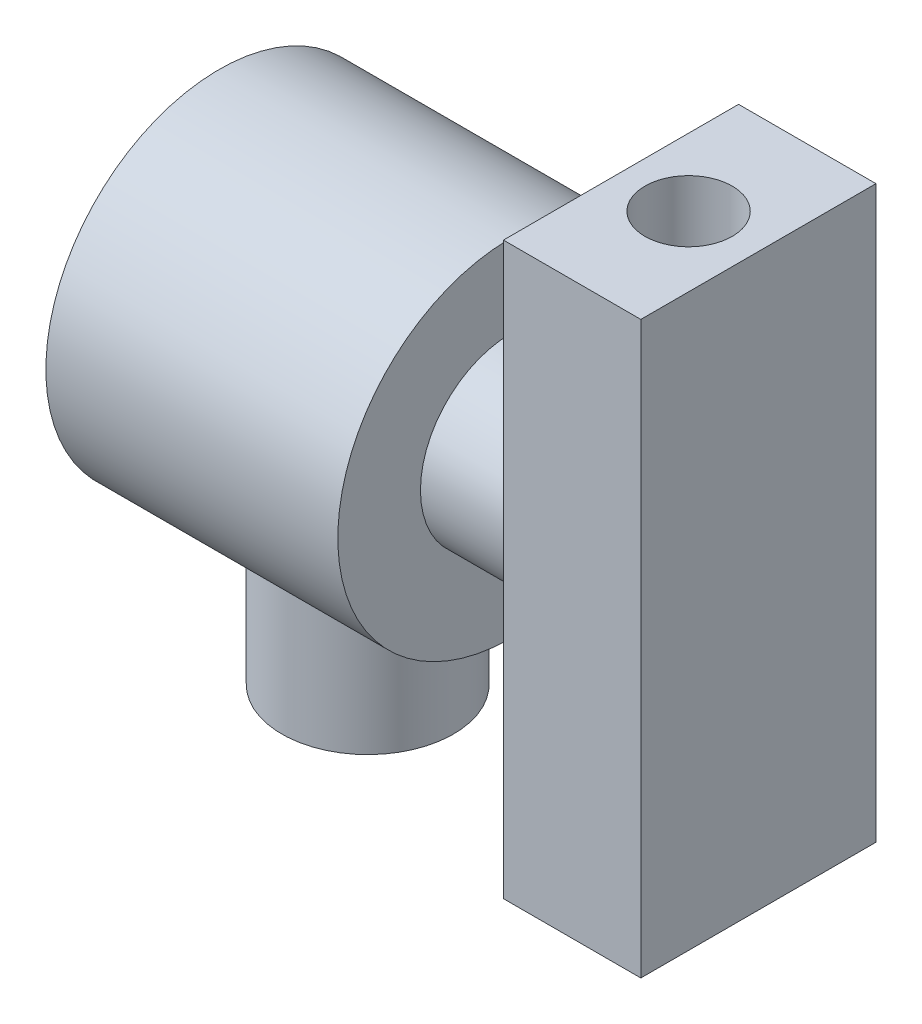
ISO-10303-21;
HEADER;
FILE_DESCRIPTION(('STEP AP214'),'2;1');
FILE_NAME('part.step','',(''),(''),'','','');
FILE_SCHEMA(('AUTOMOTIVE_DESIGN { 1 0 10303 214 1 1 1 1 }'));
ENDSEC;
DATA;
#1=APPLICATION_CONTEXT('core data for automotive mechanical design processes');
#2=APPLICATION_PROTOCOL_DEFINITION('international standard','automotive_design',2000,#1);
#3=PRODUCT_CONTEXT('',#1,'mechanical');
#4=PRODUCT('Part','Part','',(#3));
#5=PRODUCT_RELATED_PRODUCT_CATEGORY('part','',(#4));
#6=PRODUCT_DEFINITION_FORMATION('','',#4);
#7=PRODUCT_DEFINITION_CONTEXT('part definition',#1,'design');
#8=PRODUCT_DEFINITION('design','',#6,#7);
#9=PRODUCT_DEFINITION_SHAPE('','',#8);
#10=(LENGTH_UNIT() NAMED_UNIT(*) SI_UNIT(.MILLI.,.METRE.));
#11=(NAMED_UNIT(*) PLANE_ANGLE_UNIT() SI_UNIT($,.RADIAN.));
#12=(NAMED_UNIT(*) SI_UNIT($,.STERADIAN.) SOLID_ANGLE_UNIT());
#13=UNCERTAINTY_MEASURE_WITH_UNIT(LENGTH_MEASURE(1.E-05),#10,'distance_accuracy_value','');
#14=(GEOMETRIC_REPRESENTATION_CONTEXT(3) GLOBAL_UNCERTAINTY_ASSIGNED_CONTEXT((#13)) GLOBAL_UNIT_ASSIGNED_CONTEXT((#10,
#11,#12)) REPRESENTATION_CONTEXT('',''));
#15=CARTESIAN_POINT('',(0.,0.,0.));
#16=DIRECTION('',(0.,0.,1.));
#17=DIRECTION('',(1.,0.,0.));
#18=AXIS2_PLACEMENT_3D('',#15,#16,#17);
#19=CARTESIAN_POINT('',(78.5,41.515466021651,17.1150110618506));
#20=DIRECTION('',(0.,0.,-1.));
#21=DIRECTION('',(-1.,0.,0.));
#22=AXIS2_PLACEMENT_3D('',#19,#20,#21);
#23=PLANE('',#22);
#24=DIRECTION('',(0.,-1.,0.));
#25=VECTOR('',#24,1.);
#26=CARTESIAN_POINT('',(58.5,41.515466021651,17.1150110618506));
#27=LINE('',#26,#25);
#28=CARTESIAN_POINT('',(58.5,41.515466021651,17.1150110618506));
#29=VERTEX_POINT('',#28);
#30=CARTESIAN_POINT('',(58.5,-41.515466021651,17.1150110618506));
#31=VERTEX_POINT('',#30);
#32=EDGE_CURVE('E117',#29,#31,#27,.T.);
#33=ORIENTED_EDGE('',*,*,#32,.T.);
#34=DIRECTION('',(-1.,0.,0.));
#35=VECTOR('',#34,1.);
#36=CARTESIAN_POINT('',(78.5,-41.515466021651,17.1150110618506));
#37=LINE('',#36,#35);
#38=CARTESIAN_POINT('',(78.5,-41.515466021651,17.1150110618506));
#39=VERTEX_POINT('',#38);
#40=EDGE_CURVE('E12',#39,#31,#37,.T.);
#41=ORIENTED_EDGE('',*,*,#40,.F.);
#42=DIRECTION('',(0.,-1.,0.));
#43=VECTOR('',#42,1.);
#44=CARTESIAN_POINT('',(78.5,41.515466021651,17.1150110618506));
#45=LINE('',#44,#43);
#46=CARTESIAN_POINT('',(78.5,41.515466021651,17.1150110618506));
#47=VERTEX_POINT('',#46);
#48=EDGE_CURVE('E105',#47,#39,#45,.T.);
#49=ORIENTED_EDGE('',*,*,#48,.F.);
#50=DIRECTION('',(-1.,0.,0.));
#51=VECTOR('',#50,1.);
#52=CARTESIAN_POINT('',(78.5,41.515466021651,17.1150110618506));
#53=LINE('',#52,#51);
#54=EDGE_CURVE('E113',#47,#29,#53,.T.);
#55=ORIENTED_EDGE('',*,*,#54,.T.);
#56=EDGE_LOOP('',(#33,#41,#49,#55));
#57=FACE_BOUND('',#56,.T.);
#58=ADVANCED_FACE('F54',(#57),#23,.F.);
#59=CARTESIAN_POINT('',(78.5,-41.515466021651,-17.1150110618506));
#60=DIRECTION('',(0.,1.,0.));
#61=DIRECTION('',(0.,0.,1.));
#62=AXIS2_PLACEMENT_3D('',#59,#60,#61);
#63=PLANE('',#62);
#64=CARTESIAN_POINT('',(68.4753121749808,-41.515466021651,0.));
#65=DIRECTION('',(0.,-1.,0.));
#66=DIRECTION('',(0.,0.,-1.));
#67=AXIS2_PLACEMENT_3D('',#64,#65,#66);
#68=CIRCLE('',#67,6.35000000000001);
#69=CARTESIAN_POINT('',(68.4753121749808,-41.515466021651,-6.35000000000001));
#70=VERTEX_POINT('',#69);
#71=EDGE_CURVE('E137',#70,#70,#68,.T.);
#72=ORIENTED_EDGE('',*,*,#71,.F.);
#73=EDGE_LOOP('',(#72));
#74=FACE_BOUND('',#73,.T.);
#75=DIRECTION('',(0.,0.,-1.));
#76=VECTOR('',#75,1.);
#77=CARTESIAN_POINT('',(58.5,-41.515466021651,-17.1150110618506));
#78=LINE('',#77,#76);
#79=CARTESIAN_POINT('',(58.5,-41.515466021651,-17.1150110618506));
#80=VERTEX_POINT('',#79);
#81=EDGE_CURVE('E109',#31,#80,#78,.T.);
#82=ORIENTED_EDGE('',*,*,#81,.T.);
#83=DIRECTION('',(-1.,0.,0.));
#84=VECTOR('',#83,1.);
#85=CARTESIAN_POINT('',(78.5,-41.515466021651,-17.1150110618506));
#86=LINE('',#85,#84);
#87=CARTESIAN_POINT('',(78.5,-41.515466021651,-17.1150110618506));
#88=VERTEX_POINT('',#87);
#89=EDGE_CURVE('E62',#88,#80,#86,.T.);
#90=ORIENTED_EDGE('',*,*,#89,.F.);
#91=DIRECTION('',(0.,0.,-1.));
#92=VECTOR('',#91,1.);
#93=CARTESIAN_POINT('',(78.5,-41.515466021651,-17.1150110618506));
#94=LINE('',#93,#92);
#95=EDGE_CURVE('E100',#39,#88,#94,.T.);
#96=ORIENTED_EDGE('',*,*,#95,.F.);
#97=ORIENTED_EDGE('',*,*,#40,.T.);
#98=EDGE_LOOP('',(#82,#90,#96,#97));
#99=FACE_BOUND('',#98,.T.);
#100=ADVANCED_FACE('F108',(#74,#99),#63,.F.);
#101=CARTESIAN_POINT('',(78.5,41.515466021651,-17.1150110618506));
#102=DIRECTION('',(0.,0.,1.));
#103=DIRECTION('',(1.,0.,0.));
#104=AXIS2_PLACEMENT_3D('',#101,#102,#103);
#105=PLANE('',#104);
#106=DIRECTION('',(0.,1.,0.));
#107=VECTOR('',#106,1.);
#108=CARTESIAN_POINT('',(58.5,41.515466021651,-17.1150110618506));
#109=LINE('',#108,#107);
#110=CARTESIAN_POINT('',(58.5,41.515466021651,-17.1150110618506));
#111=VERTEX_POINT('',#110);
#112=EDGE_CURVE('E87',#80,#111,#109,.T.);
#113=ORIENTED_EDGE('',*,*,#112,.T.);
#114=DIRECTION('',(-1.,0.,0.));
#115=VECTOR('',#114,1.);
#116=CARTESIAN_POINT('',(78.5,41.515466021651,-17.1150110618506));
#117=LINE('',#116,#115);
#118=CARTESIAN_POINT('',(78.5,41.515466021651,-17.1150110618506));
#119=VERTEX_POINT('',#118);
#120=EDGE_CURVE('E110',#119,#111,#117,.T.);
#121=ORIENTED_EDGE('',*,*,#120,.F.);
#122=DIRECTION('',(0.,1.,0.));
#123=VECTOR('',#122,1.);
#124=CARTESIAN_POINT('',(78.5,41.515466021651,-17.1150110618506));
#125=LINE('',#124,#123);
#126=EDGE_CURVE('E103',#88,#119,#125,.T.);
#127=ORIENTED_EDGE('',*,*,#126,.F.);
#128=ORIENTED_EDGE('',*,*,#89,.T.);
#129=EDGE_LOOP('',(#113,#121,#127,#128));
#130=FACE_BOUND('',#129,.T.);
#131=ADVANCED_FACE('F111',(#130),#105,.F.);
#132=CARTESIAN_POINT('',(78.5,41.515466021651,-17.1150110618506));
#133=DIRECTION('',(0.,-1.,0.));
#134=DIRECTION('',(0.,0.,-1.));
#135=AXIS2_PLACEMENT_3D('',#132,#133,#134);
#136=PLANE('',#135);
#137=CARTESIAN_POINT('',(68.3392910293412,41.515466021651,0.));
#138=DIRECTION('',(0.,1.,0.));
#139=DIRECTION('',(0.,0.,1.));
#140=AXIS2_PLACEMENT_3D('',#137,#138,#139);
#141=CIRCLE('',#140,6.35000000000001);
#142=CARTESIAN_POINT('',(68.3392910293412,41.515466021651,6.35000000000001));
#143=VERTEX_POINT('',#142);
#144=EDGE_CURVE('E131',#143,#143,#141,.T.);
#145=ORIENTED_EDGE('',*,*,#144,.F.);
#146=EDGE_LOOP('',(#145));
#147=FACE_BOUND('',#146,.T.);
#148=DIRECTION('',(0.,0.,1.));
#149=VECTOR('',#148,1.);
#150=CARTESIAN_POINT('',(58.5,41.515466021651,-17.1150110618506));
#151=LINE('',#150,#149);
#152=EDGE_CURVE('E93',#111,#29,#151,.T.);
#153=ORIENTED_EDGE('',*,*,#152,.T.);
#154=ORIENTED_EDGE('',*,*,#54,.F.);
#155=DIRECTION('',(0.,0.,1.));
#156=VECTOR('',#155,1.);
#157=CARTESIAN_POINT('',(78.5,41.515466021651,-17.1150110618506));
#158=LINE('',#157,#156);
#159=EDGE_CURVE('E70',#119,#47,#158,.T.);
#160=ORIENTED_EDGE('',*,*,#159,.F.);
#161=ORIENTED_EDGE('',*,*,#120,.T.);
#162=EDGE_LOOP('',(#153,#154,#160,#161));
#163=FACE_BOUND('',#162,.T.);
#164=ADVANCED_FACE('F125',(#147,#163),#136,.F.);
#165=CARTESIAN_POINT('',(78.5,0.,0.));
#166=DIRECTION('',(-1.,0.,0.));
#167=DIRECTION('',(0.,0.,1.));
#168=AXIS2_PLACEMENT_3D('',#165,#166,#167);
#169=PLANE('',#168);
#170=ORIENTED_EDGE('',*,*,#48,.T.);
#171=ORIENTED_EDGE('',*,*,#95,.T.);
#172=ORIENTED_EDGE('',*,*,#126,.T.);
#173=ORIENTED_EDGE('',*,*,#159,.T.);
#174=EDGE_LOOP('',(#170,#171,#172,#173));
#175=FACE_BOUND('',#174,.T.);
#176=ADVANCED_FACE('F101',(#175),#169,.F.);
#177=CARTESIAN_POINT('',(58.5,0.,0.));
#178=DIRECTION('',(-1.,0.,0.));
#179=DIRECTION('',(0.,0.,1.));
#180=AXIS2_PLACEMENT_3D('',#177,#178,#179);
#181=PLANE('',#180);
#182=ORIENTED_EDGE('',*,*,#32,.F.);
#183=ORIENTED_EDGE('',*,*,#152,.F.);
#184=ORIENTED_EDGE('',*,*,#112,.F.);
#185=ORIENTED_EDGE('',*,*,#81,.F.);
#186=EDGE_LOOP('',(#182,#183,#184,#185));
#187=FACE_BOUND('',#186,.T.);
#188=ADVANCED_FACE('F128',(#187),#181,.T.);
#189=CARTESIAN_POINT('',(68.3392910293412,21.515466021651,0.));
#190=DIRECTION('',(0.,1.,0.));
#191=DIRECTION('',(0.,0.,1.));
#192=AXIS2_PLACEMENT_3D('',#189,#190,#191);
#193=CYLINDRICAL_SURFACE('',#192,6.35000000000001);
#194=CARTESIAN_POINT('',(68.3392910293412,21.515466021651,0.));
#195=DIRECTION('',(0.,1.,0.));
#196=DIRECTION('',(0.,0.,1.));
#197=AXIS2_PLACEMENT_3D('',#194,#195,#196);
#198=CIRCLE('',#197,6.35000000000001);
#199=CARTESIAN_POINT('',(68.3392910293412,21.515466021651,6.35000000000001));
#200=VERTEX_POINT('',#199);
#201=EDGE_CURVE('E120',#200,#200,#198,.T.);
#202=ORIENTED_EDGE('',*,*,#201,.F.);
#203=EDGE_LOOP('',(#202));
#204=FACE_BOUND('',#203,.T.);
#205=ORIENTED_EDGE('',*,*,#144,.T.);
#206=EDGE_LOOP('',(#205));
#207=FACE_BOUND('',#206,.T.);
#208=ADVANCED_FACE('F164',(#204,#207),#193,.F.);
#209=CARTESIAN_POINT('',(68.3392910293412,21.515466021651,0.));
#210=DIRECTION('',(0.,1.,0.));
#211=DIRECTION('',(0.,0.,1.));
#212=AXIS2_PLACEMENT_3D('',#209,#210,#211);
#213=PLANE('',#212);
#214=ORIENTED_EDGE('',*,*,#201,.T.);
#215=EDGE_LOOP('',(#214));
#216=FACE_BOUND('',#215,.T.);
#217=ADVANCED_FACE('F148',(#216),#213,.T.);
#218=CARTESIAN_POINT('',(68.4753121749808,-21.515466021651,0.));
#219=DIRECTION('',(0.,-1.,0.));
#220=DIRECTION('',(0.,0.,-1.));
#221=AXIS2_PLACEMENT_3D('',#218,#219,#220);
#222=CYLINDRICAL_SURFACE('',#221,6.35000000000001);
#223=CARTESIAN_POINT('',(68.4753121749808,-21.515466021651,0.));
#224=DIRECTION('',(0.,-1.,0.));
#225=DIRECTION('',(0.,0.,-1.));
#226=AXIS2_PLACEMENT_3D('',#223,#224,#225);
#227=CIRCLE('',#226,6.35000000000001);
#228=CARTESIAN_POINT('',(68.4753121749808,-21.515466021651,-6.35000000000001));
#229=VERTEX_POINT('',#228);
#230=EDGE_CURVE('E134',#229,#229,#227,.T.);
#231=ORIENTED_EDGE('',*,*,#230,.F.);
#232=EDGE_LOOP('',(#231));
#233=FACE_BOUND('',#232,.T.);
#234=ORIENTED_EDGE('',*,*,#71,.T.);
#235=EDGE_LOOP('',(#234));
#236=FACE_BOUND('',#235,.T.);
#237=ADVANCED_FACE('F145',(#233,#236),#222,.F.);
#238=CARTESIAN_POINT('',(68.4753121749808,-21.515466021651,0.));
#239=DIRECTION('',(0.,-1.,0.));
#240=DIRECTION('',(0.,0.,-1.));
#241=AXIS2_PLACEMENT_3D('',#238,#239,#240);
#242=PLANE('',#241);
#243=ORIENTED_EDGE('',*,*,#230,.T.);
#244=EDGE_LOOP('',(#243));
#245=FACE_BOUND('',#244,.T.);
#246=ADVANCED_FACE('F143',(#245),#242,.T.);
#247=CLOSED_SHELL('',(#58,#100,#131,#164,#176,#188,#208,#217,#237,#246));
#248=MANIFOLD_SOLID_BREP('B2',#247);
#249=CARTESIAN_POINT('',(58.5,0.,0.));
#250=DIRECTION('',(-1.,0.,0.));
#251=DIRECTION('',(0.,0.,1.));
#252=AXIS2_PLACEMENT_3D('',#249,#250,#251);
#253=CYLINDRICAL_SURFACE('',#252,13.197131211677);
#254=CARTESIAN_POINT('',(58.5,0.,0.));
#255=DIRECTION('',(1.,0.,0.));
#256=DIRECTION('',(0.,0.,-1.));
#257=AXIS2_PLACEMENT_3D('',#254,#255,#256);
#258=CIRCLE('',#257,13.197131211677);
#259=CARTESIAN_POINT('',(58.5,0.,-13.197131211677));
#260=VERTEX_POINT('',#259);
#261=EDGE_CURVE('E53',#260,#260,#258,.T.);
#262=ORIENTED_EDGE('',*,*,#261,.F.);
#263=EDGE_LOOP('',(#262));
#264=FACE_BOUND('',#263,.T.);
#265=CARTESIAN_POINT('',(42.5,0.,0.));
#266=DIRECTION('',(1.,0.,0.));
#267=DIRECTION('',(0.,0.,-1.));
#268=AXIS2_PLACEMENT_3D('',#265,#266,#267);
#269=CIRCLE('',#268,13.197131211677);
#270=CARTESIAN_POINT('',(42.5,0.,-13.197131211677));
#271=VERTEX_POINT('',#270);
#272=EDGE_CURVE('E270',#271,#271,#269,.T.);
#273=ORIENTED_EDGE('',*,*,#272,.T.);
#274=EDGE_LOOP('',(#273));
#275=FACE_BOUND('',#274,.T.);
#276=ADVANCED_FACE('F267',(#264,#275),#253,.T.);
#277=CARTESIAN_POINT('',(58.5,0.,0.));
#278=DIRECTION('',(1.,0.,0.));
#279=DIRECTION('',(0.,0.,-1.));
#280=AXIS2_PLACEMENT_3D('',#277,#278,#279);
#281=PLANE('',#280);
#282=ORIENTED_EDGE('',*,*,#261,.T.);
#283=EDGE_LOOP('',(#282));
#284=FACE_BOUND('',#283,.T.);
#285=ADVANCED_FACE('F282',(#284),#281,.T.);
#286=CARTESIAN_POINT('',(42.5,0.,0.));
#287=DIRECTION('',(1.,0.,0.));
#288=DIRECTION('',(0.,0.,-1.));
#289=AXIS2_PLACEMENT_3D('',#286,#287,#288);
#290=PLANE('',#289);
#291=ORIENTED_EDGE('',*,*,#272,.F.);
#292=EDGE_LOOP('',(#291));
#293=FACE_BOUND('',#292,.T.);
#294=ADVANCED_FACE('F280',(#293),#290,.F.);
#295=CLOSED_SHELL('',(#276,#285,#294));
#296=MANIFOLD_SOLID_BREP('B6',#295);
#297=CARTESIAN_POINT('',(42.5,0.,0.));
#298=DIRECTION('',(-1.,0.,0.));
#299=DIRECTION('',(0.,0.,1.));
#300=AXIS2_PLACEMENT_3D('',#297,#298,#299);
#301=CYLINDRICAL_SURFACE('',#300,25.225);
#302=CARTESIAN_POINT('',(0.,0.,0.));
#303=DIRECTION('',(1.,0.,0.));
#304=DIRECTION('',(0.,0.,-1.));
#305=AXIS2_PLACEMENT_3D('',#302,#303,#304);
#306=CIRCLE('',#305,25.225);
#307=CARTESIAN_POINT('',(0.,0.,-25.225));
#308=VERTEX_POINT('',#307);
#309=EDGE_CURVE('E358',#308,#308,#306,.T.);
#310=ORIENTED_EDGE('',*,*,#309,.T.);
#311=EDGE_LOOP('',(#310));
#312=FACE_BOUND('',#311,.T.);
#313=CARTESIAN_POINT('',(42.5,0.,0.));
#314=DIRECTION('',(1.,0.,0.));
#315=DIRECTION('',(0.,0.,-1.));
#316=AXIS2_PLACEMENT_3D('',#313,#314,#315);
#317=CIRCLE('',#316,25.225);
#318=CARTESIAN_POINT('',(42.5,0.,-25.225));
#319=VERTEX_POINT('',#318);
#320=EDGE_CURVE('E349',#319,#319,#317,.T.);
#321=ORIENTED_EDGE('',*,*,#320,.F.);
#322=EDGE_LOOP('',(#321));
#323=FACE_BOUND('',#322,.T.);
#324=DIRECTION('',(-1.,0.,0.));
#325=VECTOR('',#324,1.);
#326=CARTESIAN_POINT('',(42.5,-22.515466021651,11.3734082327102));
#327=LINE('',#326,#325);
#328=CARTESIAN_POINT('',(26.8060842489657,-22.515466021651,11.3734082327102));
#329=VERTEX_POINT('',#328);
#330=CARTESIAN_POINT('',(16.433893511784,-22.515466021651,11.3734082327102));
#331=VERTEX_POINT('',#330);
#332=EDGE_CURVE('E265',#329,#331,#327,.T.);
#333=ORIENTED_EDGE('',*,*,#332,.F.);
#334=CARTESIAN_POINT('',(26.8060842489657,-22.515466021651,11.3734082327102));
#335=CARTESIAN_POINT('',(27.1357709535332,-22.5913938600849,11.2230841113031));
#336=CARTESIAN_POINT('',(27.4578461189028,-22.6724481295255,11.0589013228001));
#337=CARTESIAN_POINT('',(28.0850266057939,-22.8419861127661,10.704342359417));
#338=CARTESIAN_POINT('',(28.390138504265,-22.9304669133043,10.51397643705));
#339=CARTESIAN_POINT('',(28.9821510182056,-23.1121734928875,10.1082873671934));
#340=CARTESIAN_POINT('',(29.2690363239279,-23.2054031454264,9.89294365716297));
#341=CARTESIAN_POINT('',(29.8228897628967,-23.3938110725832,9.43878503603852));
#342=CARTESIAN_POINT('',(30.0898579656175,-23.4889893404025,9.1999702068226));
#343=CARTESIAN_POINT('',(30.6023396586088,-23.6786105366298,8.70030973134071));
#344=CARTESIAN_POINT('',(30.8478631037458,-23.773053787493,8.43947441897834));
#345=CARTESIAN_POINT('',(31.3160243946473,-23.9586637570251,7.89716049402939));
#346=CARTESIAN_POINT('',(31.5386735403145,-24.0498320788913,7.61569219304218));
#347=CARTESIAN_POINT('',(31.9596853532693,-24.2265027666979,7.03347139666256));
#348=CARTESIAN_POINT('',(32.1580491295862,-24.3120053912893,6.73271978282906));
#349=CARTESIAN_POINT('',(32.5288952584507,-24.475030566147,6.11358795475328));
#350=CARTESIAN_POINT('',(32.7013780255459,-24.5525532442254,5.79520802298348));
#351=CARTESIAN_POINT('',(33.0174334658734,-24.6968169491043,5.14563492526571));
#352=CARTESIAN_POINT('',(33.161246224497,-24.7636464993393,4.81457848389906));
#353=CARTESIAN_POINT('',(33.4202763700275,-24.8854241387625,4.1393192580318));
#354=CARTESIAN_POINT('',(33.5354937173821,-24.9403722115165,3.79511645534824));
#355=CARTESIAN_POINT('',(33.7358484096037,-25.0367122703421,3.09643828648941));
#356=CARTESIAN_POINT('',(33.8210049750723,-25.0781129172781,2.74196964167912));
#357=CARTESIAN_POINT('',(33.9601717951028,-25.1461137947785,2.02558226559139));
#358=CARTESIAN_POINT('',(34.01418542125,-25.1727156274757,1.66366434518009));
#359=CARTESIAN_POINT('',(34.0865526427011,-25.2084305213917,0.971460178194658));
#360=CARTESIAN_POINT('',(34.1078869305292,-25.2190043267162,0.641557359312634));
#361=CARTESIAN_POINT('',(34.1243393237807,-25.2271549400205,-0.0190501390825301));
#362=CARTESIAN_POINT('',(34.1194593304593,-25.2247326905711,-0.349754758704221));
#363=CARTESIAN_POINT('',(34.0835492986753,-25.2069578436593,-1.00932208474196));
#364=CARTESIAN_POINT('',(34.0525241221089,-25.191607650247,-1.33818512216946));
#365=CARTESIAN_POINT('',(33.9647101114636,-25.1483857776446,-1.99161392282001));
#366=CARTESIAN_POINT('',(33.9079213390229,-25.1205141284115,-2.31617969632216));
#367=CARTESIAN_POINT('',(33.7722021124665,-25.0544120171693,-2.94494877174499));
#368=CARTESIAN_POINT('',(33.6943172339212,-25.0166730820442,-3.24943069978678));
#369=CARTESIAN_POINT('',(33.5163253418938,-24.931252517285,-3.85037410906514));
#370=CARTESIAN_POINT('',(33.4162192059752,-24.8835712802976,-4.14683590651473));
#371=CARTESIAN_POINT('',(33.1946948351512,-24.7793239499422,-4.73006317942528));
#372=CARTESIAN_POINT('',(33.0732763459966,-24.7227577505805,-5.01682853916234));
#373=CARTESIAN_POINT('',(32.8100730493487,-24.6019295670727,-5.5792896670395));
#374=CARTESIAN_POINT('',(32.6682804691347,-24.5376646474258,-5.85498115890021));
#375=CARTESIAN_POINT('',(32.3558825015556,-24.3985504960427,-6.41081071035901));
#376=CARTESIAN_POINT('',(32.1840280515725,-24.3232902886045,-6.69014394487247));
#377=CARTESIAN_POINT('',(31.8196639993403,-24.1672689072172,-7.23351106741105));
#378=CARTESIAN_POINT('',(31.6271466773566,-24.0865056814615,-7.49753918024519));
#379=CARTESIAN_POINT('',(31.2226463385826,-23.9212786281895,-8.00907701239128));
#380=CARTESIAN_POINT('',(31.0106597416412,-23.8368141215541,-8.25658367911249));
#381=CARTESIAN_POINT('',(30.5683900989071,-23.666070682935,-8.73395590183404));
#382=CARTESIAN_POINT('',(30.33810825384,-23.5797918702978,-8.96382261360935));
#383=CARTESIAN_POINT('',(29.8571281102769,-23.4061984427266,-9.40787367066967));
#384=CARTESIAN_POINT('',(29.6061988278839,-23.318885329325,-9.62180850530324));
#385=CARTESIAN_POINT('',(29.0877516418739,-23.1464541453064,-10.0295203940174));
#386=CARTESIAN_POINT('',(28.8202337014104,-23.0613360795657,-10.223297403321));
#387=CARTESIAN_POINT('',(28.2698094198643,-22.895456785701,-10.5895757652192));
#388=CARTESIAN_POINT('',(27.9869071208587,-22.8146944241631,-10.7620826677609));
#389=CARTESIAN_POINT('',(27.4068489662129,-22.659659090127,-11.0847860422545));
#390=CARTESIAN_POINT('',(27.1096888834466,-22.585388060815,-11.2349758429171));
#391=CARTESIAN_POINT('',(26.8060842489657,-22.515466021651,-11.3734082327102));
#392=B_SPLINE_CURVE_WITH_KNOTS('',3,(#334,#335,#336,#337,#338,#339,#340,#341,#342,#343,#344,
#345,#346,#347,#348,#349,#350,#351,#352,#353,#354,#355,#356,#357,#358,#359,#360,#361,#362,#363,
#364,#365,#366,#367,#368,#369,#370,#371,#372,#373,#374,#375,#376,#377,#378,#379,#380,#381,#382,
#383,#384,#385,#386,#387,#388,#389,#390,#391),.UNSPECIFIED.,.F.,.F.,(4,2,2,2,2,2,2,2,2,2,2,2,2,
2,2,2,2,2,2,2,2,2,2,2,2,2,2,2,4),(0.,1.11011820722445,2.21980295717715,3.33040780819616,
4.44100878505093,5.55109143917535,6.6606230486977,7.7701039708171,8.87956711998815,
9.97930841989091,11.0790512409187,12.1780896169042,13.2770089868553,14.2680257104497,
15.2589705590899,16.249731174633,17.2404894198405,18.1890677338206,19.1376085931395,
20.0861607690004,21.0350757832981,22.0434815216113,23.0522653246098,24.0612350029139,
25.0701385166891,26.0924731306006,27.1148100153922,28.1368795777376,29.1592540570686),.UNSPECIFIED.);
#393=CARTESIAN_POINT('',(26.8060842489657,-22.515466021651,-11.3734082327102));
#394=VERTEX_POINT('',#393);
#395=EDGE_CURVE('E323',#329,#394,#392,.T.);
#396=ORIENTED_EDGE('',*,*,#395,.T.);
#397=DIRECTION('',(-1.,0.,0.));
#398=VECTOR('',#397,1.);
#399=CARTESIAN_POINT('',(42.5,-22.515466021651,-11.3734082327102));
#400=LINE('',#399,#398);
#401=CARTESIAN_POINT('',(16.433893511784,-22.515466021651,-11.3734082327102));
#402=VERTEX_POINT('',#401);
#403=EDGE_CURVE('E338',#402,#394,#400,.F.);
#404=ORIENTED_EDGE('',*,*,#403,.F.);
#405=CARTESIAN_POINT('',(16.433893511784,-22.515466021651,-11.3734082327102));
#406=CARTESIAN_POINT('',(16.1042068072165,-22.5913938600849,-11.2230841113031));
#407=CARTESIAN_POINT('',(15.7821316418469,-22.6724481295255,-11.0589013228001));
#408=CARTESIAN_POINT('',(15.1549511549559,-22.8419861127661,-10.704342359417));
#409=CARTESIAN_POINT('',(14.8498392564847,-22.9304669133043,-10.51397643705));
#410=CARTESIAN_POINT('',(14.2578267425441,-23.1121734928875,-10.1082873671934));
#411=CARTESIAN_POINT('',(13.9709414368218,-23.2054031454264,-9.89294365716297));
#412=CARTESIAN_POINT('',(13.417087997853,-23.3938110725832,-9.43878503603852));
#413=CARTESIAN_POINT('',(13.1501197951322,-23.4889893404025,-9.1999702068226));
#414=CARTESIAN_POINT('',(12.637638102141,-23.6786105366298,-8.70030973134071));
#415=CARTESIAN_POINT('',(12.3921146570039,-23.773053787493,-8.43947441897834));
#416=CARTESIAN_POINT('',(11.9239533661024,-23.9586637570251,-7.89716049402939));
#417=CARTESIAN_POINT('',(11.7013042204353,-24.0498320788913,-7.61569219304219));
#418=CARTESIAN_POINT('',(11.2802924074804,-24.2265027666979,-7.03347139666256));
#419=CARTESIAN_POINT('',(11.0819286311635,-24.3120053912893,-6.73271978282906));
#420=CARTESIAN_POINT('',(10.711082502299,-24.475030566147,-6.11358795475328));
#421=CARTESIAN_POINT('',(10.5385997352038,-24.5525532442254,-5.79520802298348));
#422=CARTESIAN_POINT('',(10.2225442948763,-24.6968169491042,-5.14563492526572));
#423=CARTESIAN_POINT('',(10.0787315362528,-24.7636464993393,-4.81457848389906));
#424=CARTESIAN_POINT('',(9.81970139072223,-24.8854241387625,-4.1393192580318));
#425=CARTESIAN_POINT('',(9.70448404336767,-24.9403722115165,-3.79511645534825));
#426=CARTESIAN_POINT('',(9.50412935114601,-25.0367122703421,-3.09643828648942));
#427=CARTESIAN_POINT('',(9.41897278567744,-25.0781129172781,-2.74196964167912));
#428=CARTESIAN_POINT('',(9.27980596564692,-25.1461137947785,-2.02558226559139));
#429=CARTESIAN_POINT('',(9.22579233949969,-25.1727156274757,-1.66366434518009));
#430=CARTESIAN_POINT('',(9.1534251180486,-25.2084305213917,-0.97146017819466));
#431=CARTESIAN_POINT('',(9.13209083022051,-25.2190043267162,-0.641557359312635));
#432=CARTESIAN_POINT('',(9.11563843696904,-25.2271549400205,0.0190501390825278));
#433=CARTESIAN_POINT('',(9.12051843029045,-25.2247326905711,0.349754758704219));
#434=CARTESIAN_POINT('',(9.15642846207444,-25.2069578436593,1.00932208474196));
#435=CARTESIAN_POINT('',(9.18745363864084,-25.191607650247,1.33818512216945));
#436=CARTESIAN_POINT('',(9.27526764928613,-25.1483857776446,1.99161392282001));
#437=CARTESIAN_POINT('',(9.33205642172682,-25.1205141284115,2.31617969632216));
#438=CARTESIAN_POINT('',(9.46777564828321,-25.0544120171693,2.94494877174499));
#439=CARTESIAN_POINT('',(9.54566052682851,-25.0166730820442,3.24943069978678));
#440=CARTESIAN_POINT('',(9.7236524188559,-24.931252517285,3.85037410906513));
#441=CARTESIAN_POINT('',(9.82375855477447,-24.8835712802976,4.14683590651472));
#442=CARTESIAN_POINT('',(10.0452829255985,-24.7793239499422,4.73006317942528));
#443=CARTESIAN_POINT('',(10.1667014147532,-24.7227577505805,5.01682853916233));
#444=CARTESIAN_POINT('',(10.429904711401,-24.6019295670727,5.57928966703949));
#445=CARTESIAN_POINT('',(10.571697291615,-24.5376646474258,5.8549811589002));
#446=CARTESIAN_POINT('',(10.8840952591941,-24.3985504960427,6.41081071035901));
#447=CARTESIAN_POINT('',(11.0559497091772,-24.3232902886045,6.69014394487247));
#448=CARTESIAN_POINT('',(11.4203137614094,-24.1672689072172,7.23351106741105));
#449=CARTESIAN_POINT('',(11.6128310833931,-24.0865056814615,7.49753918024519));
#450=CARTESIAN_POINT('',(12.0173314221671,-23.9212786281895,8.00907701239128));
#451=CARTESIAN_POINT('',(12.2293180191085,-23.8368141215541,8.25658367911248));
#452=CARTESIAN_POINT('',(12.6715876618426,-23.666070682935,8.73395590183404));
#453=CARTESIAN_POINT('',(12.9018695069097,-23.5797918702978,8.96382261360934));
#454=CARTESIAN_POINT('',(13.3828496504728,-23.4061984427266,9.40787367066967));
#455=CARTESIAN_POINT('',(13.6337789328658,-23.318885329325,9.62180850530324));
#456=CARTESIAN_POINT('',(14.1522261188758,-23.1464541453064,10.0295203940174));
#457=CARTESIAN_POINT('',(14.4197440593393,-23.0613360795657,10.223297403321));
#458=CARTESIAN_POINT('',(14.9701683408854,-22.895456785701,10.5895757652192));
#459=CARTESIAN_POINT('',(15.253070639891,-22.8146944241631,10.7620826677609));
#460=CARTESIAN_POINT('',(15.8331287945369,-22.659659090127,11.0847860422545));
#461=CARTESIAN_POINT('',(16.1302888773031,-22.585388060815,11.2349758429171));
#462=CARTESIAN_POINT('',(16.433893511784,-22.515466021651,11.3734082327102));
#463=B_SPLINE_CURVE_WITH_KNOTS('',3,(#405,#406,#407,#408,#409,#410,#411,#412,#413,#414,#415,
#416,#417,#418,#419,#420,#421,#422,#423,#424,#425,#426,#427,#428,#429,#430,#431,#432,#433,#434,
#435,#436,#437,#438,#439,#440,#441,#442,#443,#444,#445,#446,#447,#448,#449,#450,#451,#452,#453,
#454,#455,#456,#457,#458,#459,#460,#461,#462),.UNSPECIFIED.,.F.,.F.,(4,2,2,2,2,2,2,2,2,2,2,2,2,
2,2,2,2,2,2,2,2,2,2,2,2,2,2,2,4),(0.,1.11011820722444,2.21980295717715,3.33040780819615,
4.44100878505093,5.55109143917535,6.66062304869769,7.77010397081709,8.87956711998813,
9.9793084198909,11.0790512409186,12.1780896169042,13.2770089868553,14.2680257104497,
15.2589705590899,16.249731174633,17.2404894198405,18.1890677338206,19.1376085931395,
20.0861607690004,21.0350757832981,22.0434815216113,23.0522653246098,24.0612350029139,
25.0701385166891,26.0924731306006,27.1148100153922,28.1368795777376,29.1592540570686),.UNSPECIFIED.);
#464=EDGE_CURVE('E333',#402,#331,#463,.T.);
#465=ORIENTED_EDGE('',*,*,#464,.T.);
#466=EDGE_LOOP('',(#333,#396,#404,#465));
#467=FACE_BOUND('',#466,.T.);
#468=ADVANCED_FACE('F314',(#312,#323,#467),#301,.T.);
#469=CARTESIAN_POINT('',(42.5,0.,0.));
#470=DIRECTION('',(1.,0.,0.));
#471=DIRECTION('',(0.,0.,-1.));
#472=AXIS2_PLACEMENT_3D('',#469,#470,#471);
#473=PLANE('',#472);
#474=ORIENTED_EDGE('',*,*,#320,.T.);
#475=EDGE_LOOP('',(#474));
#476=FACE_BOUND('',#475,.T.);
#477=ADVANCED_FACE('F387',(#476),#473,.T.);
#478=CARTESIAN_POINT('',(0.,0.,0.));
#479=DIRECTION('',(1.,0.,0.));
#480=DIRECTION('',(0.,0.,-1.));
#481=AXIS2_PLACEMENT_3D('',#478,#479,#480);
#482=PLANE('',#481);
#483=ORIENTED_EDGE('',*,*,#309,.F.);
#484=EDGE_LOOP('',(#483));
#485=FACE_BOUND('',#484,.T.);
#486=ADVANCED_FACE('F383',(#485),#482,.F.);
#487=CARTESIAN_POINT('',(21.6199888803749,-22.515466021651,0.));
#488=DIRECTION('',(0.,-1.,0.));
#489=DIRECTION('',(0.,0.,-1.));
#490=AXIS2_PLACEMENT_3D('',#487,#488,#489);
#491=CYLINDRICAL_SURFACE('',#490,12.5);
#492=CARTESIAN_POINT('',(21.6199888803749,-41.515466021651,0.));
#493=DIRECTION('',(0.,-1.,0.));
#494=DIRECTION('',(0.,0.,-1.));
#495=AXIS2_PLACEMENT_3D('',#492,#493,#494);
#496=CIRCLE('',#495,12.5);
#497=CARTESIAN_POINT('',(21.6199888803749,-41.515466021651,-12.5));
#498=VERTEX_POINT('',#497);
#499=EDGE_CURVE('E354',#498,#498,#496,.T.);
#500=ORIENTED_EDGE('',*,*,#499,.F.);
#501=EDGE_LOOP('',(#500));
#502=FACE_BOUND('',#501,.T.);
#503=ORIENTED_EDGE('',*,*,#395,.F.);
#504=CARTESIAN_POINT('',(21.6199888803749,-22.515466021651,0.));
#505=DIRECTION('',(0.,-1.,0.));
#506=DIRECTION('',(0.,0.,-1.));
#507=AXIS2_PLACEMENT_3D('',#504,#505,#506);
#508=CIRCLE('',#507,12.5);
#509=EDGE_CURVE('E353',#329,#331,#508,.T.);
#510=ORIENTED_EDGE('',*,*,#509,.T.);
#511=ORIENTED_EDGE('',*,*,#464,.F.);
#512=EDGE_CURVE('E347',#402,#394,#508,.T.);
#513=ORIENTED_EDGE('',*,*,#512,.T.);
#514=EDGE_LOOP('',(#503,#510,#511,#513));
#515=FACE_BOUND('',#514,.T.);
#516=ADVANCED_FACE('F351',(#502,#515),#491,.T.);
#517=CARTESIAN_POINT('',(21.6199888803749,-22.515466021651,0.));
#518=DIRECTION('',(0.,-1.,0.));
#519=DIRECTION('',(0.,0.,-1.));
#520=AXIS2_PLACEMENT_3D('',#517,#518,#519);
#521=PLANE('',#520);
#522=ORIENTED_EDGE('',*,*,#509,.F.);
#523=ORIENTED_EDGE('',*,*,#332,.T.);
#524=EDGE_LOOP('',(#522,#523));
#525=FACE_BOUND('',#524,.T.);
#526=ADVANCED_FACE('F382',(#525),#521,.F.);
#527=ORIENTED_EDGE('',*,*,#512,.F.);
#528=ORIENTED_EDGE('',*,*,#403,.T.);
#529=EDGE_LOOP('',(#527,#528));
#530=FACE_BOUND('',#529,.T.);
#531=ADVANCED_FACE('F346',(#530),#521,.F.);
#532=CARTESIAN_POINT('',(21.6199888803749,-41.515466021651,0.));
#533=DIRECTION('',(0.,-1.,0.));
#534=DIRECTION('',(0.,0.,-1.));
#535=AXIS2_PLACEMENT_3D('',#532,#533,#534);
#536=PLANE('',#535);
#537=ORIENTED_EDGE('',*,*,#499,.T.);
#538=EDGE_LOOP('',(#537));
#539=FACE_BOUND('',#538,.T.);
#540=ADVANCED_FACE('F385',(#539),#536,.T.);
#541=CLOSED_SHELL('',(#468,#477,#486,#516,#526,#531,#540));
#542=MANIFOLD_SOLID_BREP('B48',#541);
#543=ADVANCED_BREP_SHAPE_REPRESENTATION('',(#18,#248,#296,#542),#14);
#544=SHAPE_DEFINITION_REPRESENTATION(#9,#543);
ENDSEC;
END-ISO-10303-21;
